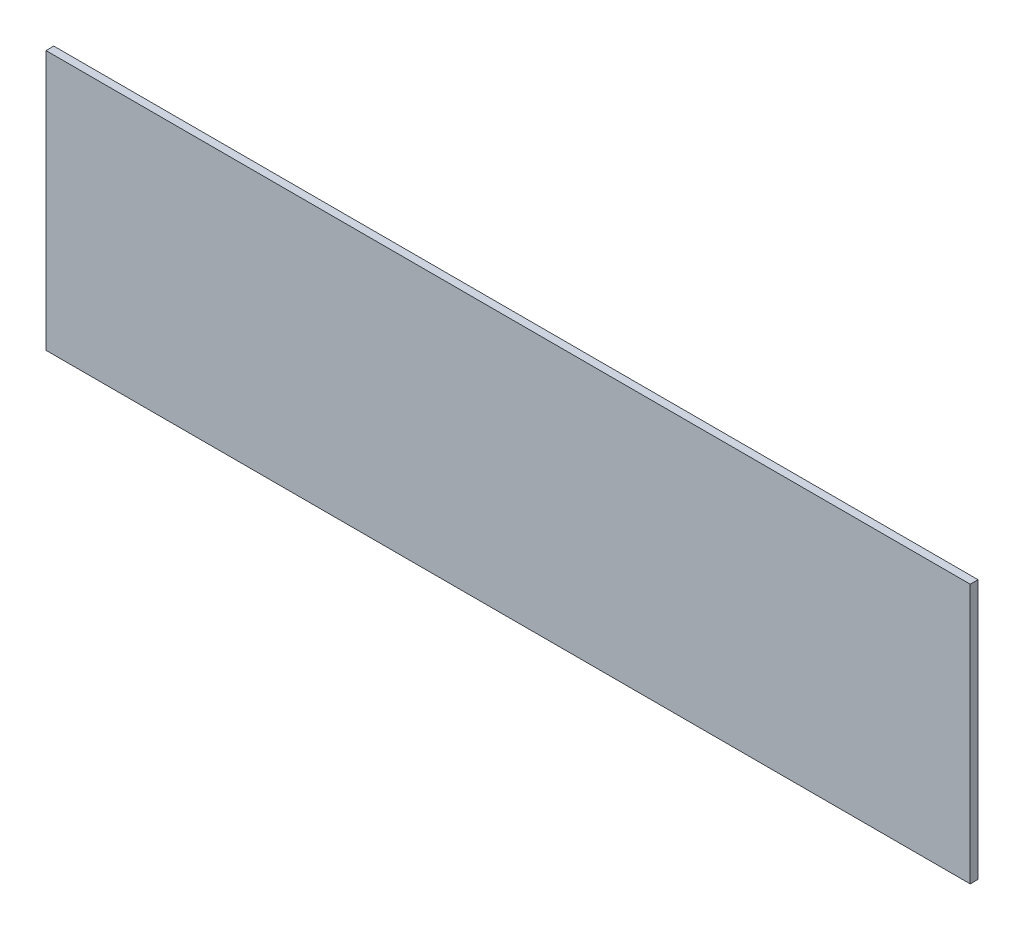
ISO-10303-21;
HEADER;
FILE_DESCRIPTION(('STEP AP214'),'2;1');
FILE_NAME('part.step','',(''),(''),'','','');
FILE_SCHEMA(('AUTOMOTIVE_DESIGN { 1 0 10303 214 1 1 1 1 }'));
ENDSEC;
DATA;
#1=APPLICATION_CONTEXT('core data for automotive mechanical design processes');
#2=APPLICATION_PROTOCOL_DEFINITION('international standard','automotive_design',2000,#1);
#3=PRODUCT_CONTEXT('',#1,'mechanical');
#4=PRODUCT('Part','Part','',(#3));
#5=PRODUCT_RELATED_PRODUCT_CATEGORY('part','',(#4));
#6=PRODUCT_DEFINITION_FORMATION('','',#4);
#7=PRODUCT_DEFINITION_CONTEXT('part definition',#1,'design');
#8=PRODUCT_DEFINITION('design','',#6,#7);
#9=PRODUCT_DEFINITION_SHAPE('','',#8);
#10=(LENGTH_UNIT() NAMED_UNIT(*) SI_UNIT(.MILLI.,.METRE.));
#11=(NAMED_UNIT(*) PLANE_ANGLE_UNIT() SI_UNIT($,.RADIAN.));
#12=(NAMED_UNIT(*) SI_UNIT($,.STERADIAN.) SOLID_ANGLE_UNIT());
#13=UNCERTAINTY_MEASURE_WITH_UNIT(LENGTH_MEASURE(1.E-05),#10,'distance_accuracy_value','');
#14=(GEOMETRIC_REPRESENTATION_CONTEXT(3) GLOBAL_UNCERTAINTY_ASSIGNED_CONTEXT((#13)) GLOBAL_UNIT_ASSIGNED_CONTEXT((#10,
#11,#12)) REPRESENTATION_CONTEXT('',''));
#15=CARTESIAN_POINT('',(0.,0.,0.));
#16=DIRECTION('',(0.,0.,1.));
#17=DIRECTION('',(1.,0.,0.));
#18=AXIS2_PLACEMENT_3D('',#15,#16,#17);
#19=CARTESIAN_POINT('',(-187.802898550725,83.0666666666667,3.));
#20=DIRECTION('',(1.,0.,0.));
#21=DIRECTION('',(0.,1.,0.));
#22=AXIS2_PLACEMENT_3D('',#19,#20,#21);
#23=PLANE('',#22);
#24=DIRECTION('',(0.,-1.,0.));
#25=VECTOR('',#24,1.);
#26=CARTESIAN_POINT('',(-187.802898550725,83.0666666666667,0.));
#27=LINE('',#26,#25);
#28=CARTESIAN_POINT('',(-187.802898550725,83.0666666666667,0.));
#29=VERTEX_POINT('',#28);
#30=CARTESIAN_POINT('',(-187.802898550725,-16.9333333333333,0.));
#31=VERTEX_POINT('',#30);
#32=EDGE_CURVE('E100',#29,#31,#27,.T.);
#33=ORIENTED_EDGE('',*,*,#32,.T.);
#34=DIRECTION('',(0.,0.,-1.));
#35=VECTOR('',#34,1.);
#36=CARTESIAN_POINT('',(-187.802898550725,-16.9333333333333,3.));
#37=LINE('',#36,#35);
#38=CARTESIAN_POINT('',(-187.802898550725,-16.9333333333333,3.));
#39=VERTEX_POINT('',#38);
#40=EDGE_CURVE('E11',#39,#31,#37,.T.);
#41=ORIENTED_EDGE('',*,*,#40,.F.);
#42=DIRECTION('',(0.,-1.,0.));
#43=VECTOR('',#42,1.);
#44=CARTESIAN_POINT('',(-187.802898550725,83.0666666666667,3.));
#45=LINE('',#44,#43);
#46=CARTESIAN_POINT('',(-187.802898550725,83.0666666666667,3.));
#47=VERTEX_POINT('',#46);
#48=EDGE_CURVE('E88',#47,#39,#45,.T.);
#49=ORIENTED_EDGE('',*,*,#48,.F.);
#50=DIRECTION('',(0.,0.,-1.));
#51=VECTOR('',#50,1.);
#52=CARTESIAN_POINT('',(-187.802898550725,83.0666666666667,3.));
#53=LINE('',#52,#51);
#54=EDGE_CURVE('E96',#47,#29,#53,.T.);
#55=ORIENTED_EDGE('',*,*,#54,.T.);
#56=EDGE_LOOP('',(#33,#41,#49,#55));
#57=FACE_BOUND('',#56,.T.);
#58=ADVANCED_FACE('F37',(#57),#23,.F.);
#59=CARTESIAN_POINT('',(-187.802898550725,-16.9333333333333,3.));
#60=DIRECTION('',(0.,1.,0.));
#61=DIRECTION('',(0.,0.,1.));
#62=AXIS2_PLACEMENT_3D('',#59,#60,#61);
#63=PLANE('',#62);
#64=DIRECTION('',(1.,0.,0.));
#65=VECTOR('',#64,1.);
#66=CARTESIAN_POINT('',(-187.802898550725,-16.9333333333333,0.));
#67=LINE('',#66,#65);
#68=CARTESIAN_POINT('',(168.197101449275,-16.9333333333333,0.));
#69=VERTEX_POINT('',#68);
#70=EDGE_CURVE('E92',#31,#69,#67,.T.);
#71=ORIENTED_EDGE('',*,*,#70,.T.);
#72=DIRECTION('',(0.,0.,-1.));
#73=VECTOR('',#72,1.);
#74=CARTESIAN_POINT('',(168.197101449275,-16.9333333333333,3.));
#75=LINE('',#74,#73);
#76=CARTESIAN_POINT('',(168.197101449275,-16.9333333333333,3.));
#77=VERTEX_POINT('',#76);
#78=EDGE_CURVE('E45',#77,#69,#75,.T.);
#79=ORIENTED_EDGE('',*,*,#78,.F.);
#80=DIRECTION('',(1.,0.,0.));
#81=VECTOR('',#80,1.);
#82=CARTESIAN_POINT('',(-187.802898550725,-16.9333333333333,3.));
#83=LINE('',#82,#81);
#84=EDGE_CURVE('E83',#39,#77,#83,.T.);
#85=ORIENTED_EDGE('',*,*,#84,.F.);
#86=ORIENTED_EDGE('',*,*,#40,.T.);
#87=EDGE_LOOP('',(#71,#79,#85,#86));
#88=FACE_BOUND('',#87,.T.);
#89=ADVANCED_FACE('F91',(#88),#63,.F.);
#90=CARTESIAN_POINT('',(168.197101449275,83.0666666666667,3.));
#91=DIRECTION('',(-1.,0.,0.));
#92=DIRECTION('',(0.,-1.,0.));
#93=AXIS2_PLACEMENT_3D('',#90,#91,#92);
#94=PLANE('',#93);
#95=DIRECTION('',(0.,1.,0.));
#96=VECTOR('',#95,1.);
#97=CARTESIAN_POINT('',(168.197101449275,83.0666666666667,0.));
#98=LINE('',#97,#96);
#99=CARTESIAN_POINT('',(168.197101449275,83.0666666666667,0.));
#100=VERTEX_POINT('',#99);
#101=EDGE_CURVE('E70',#69,#100,#98,.T.);
#102=ORIENTED_EDGE('',*,*,#101,.T.);
#103=DIRECTION('',(0.,0.,-1.));
#104=VECTOR('',#103,1.);
#105=CARTESIAN_POINT('',(168.197101449275,83.0666666666667,3.));
#106=LINE('',#105,#104);
#107=CARTESIAN_POINT('',(168.197101449275,83.0666666666667,3.));
#108=VERTEX_POINT('',#107);
#109=EDGE_CURVE('E93',#108,#100,#106,.T.);
#110=ORIENTED_EDGE('',*,*,#109,.F.);
#111=DIRECTION('',(0.,1.,0.));
#112=VECTOR('',#111,1.);
#113=CARTESIAN_POINT('',(168.197101449275,83.0666666666667,3.));
#114=LINE('',#113,#112);
#115=EDGE_CURVE('E86',#77,#108,#114,.T.);
#116=ORIENTED_EDGE('',*,*,#115,.F.);
#117=ORIENTED_EDGE('',*,*,#78,.T.);
#118=EDGE_LOOP('',(#102,#110,#116,#117));
#119=FACE_BOUND('',#118,.T.);
#120=ADVANCED_FACE('F94',(#119),#94,.F.);
#121=CARTESIAN_POINT('',(-187.802898550725,83.0666666666667,3.));
#122=DIRECTION('',(0.,-1.,0.));
#123=DIRECTION('',(0.,0.,-1.));
#124=AXIS2_PLACEMENT_3D('',#121,#122,#123);
#125=PLANE('',#124);
#126=DIRECTION('',(-1.,0.,0.));
#127=VECTOR('',#126,1.);
#128=CARTESIAN_POINT('',(-187.802898550725,83.0666666666667,0.));
#129=LINE('',#128,#127);
#130=EDGE_CURVE('E76',#100,#29,#129,.T.);
#131=ORIENTED_EDGE('',*,*,#130,.T.);
#132=ORIENTED_EDGE('',*,*,#54,.F.);
#133=DIRECTION('',(-1.,0.,0.));
#134=VECTOR('',#133,1.);
#135=CARTESIAN_POINT('',(-187.802898550725,83.0666666666667,3.));
#136=LINE('',#135,#134);
#137=EDGE_CURVE('E53',#108,#47,#136,.T.);
#138=ORIENTED_EDGE('',*,*,#137,.F.);
#139=ORIENTED_EDGE('',*,*,#109,.T.);
#140=EDGE_LOOP('',(#131,#132,#138,#139));
#141=FACE_BOUND('',#140,.T.);
#142=ADVANCED_FACE('F107',(#141),#125,.F.);
#143=CARTESIAN_POINT('',(0.,0.,3.));
#144=DIRECTION('',(0.,0.,1.));
#145=DIRECTION('',(1.,0.,0.));
#146=AXIS2_PLACEMENT_3D('',#143,#144,#145);
#147=PLANE('',#146);
#148=ORIENTED_EDGE('',*,*,#48,.T.);
#149=ORIENTED_EDGE('',*,*,#84,.T.);
#150=ORIENTED_EDGE('',*,*,#115,.T.);
#151=ORIENTED_EDGE('',*,*,#137,.T.);
#152=EDGE_LOOP('',(#148,#149,#150,#151));
#153=FACE_BOUND('',#152,.T.);
#154=ADVANCED_FACE('F84',(#153),#147,.T.);
#155=CARTESIAN_POINT('',(0.,0.,0.));
#156=DIRECTION('',(0.,0.,1.));
#157=DIRECTION('',(1.,0.,0.));
#158=AXIS2_PLACEMENT_3D('',#155,#156,#157);
#159=PLANE('',#158);
#160=ORIENTED_EDGE('',*,*,#32,.F.);
#161=ORIENTED_EDGE('',*,*,#130,.F.);
#162=ORIENTED_EDGE('',*,*,#101,.F.);
#163=ORIENTED_EDGE('',*,*,#70,.F.);
#164=EDGE_LOOP('',(#160,#161,#162,#163));
#165=FACE_BOUND('',#164,.T.);
#166=ADVANCED_FACE('F110',(#165),#159,.F.);
#167=CLOSED_SHELL('',(#58,#89,#120,#142,#154,#166));
#168=MANIFOLD_SOLID_BREP('B2',#167);
#169=ADVANCED_BREP_SHAPE_REPRESENTATION('',(#18,#168),#14);
#170=SHAPE_DEFINITION_REPRESENTATION(#9,#169);
ENDSEC;
END-ISO-10303-21;
